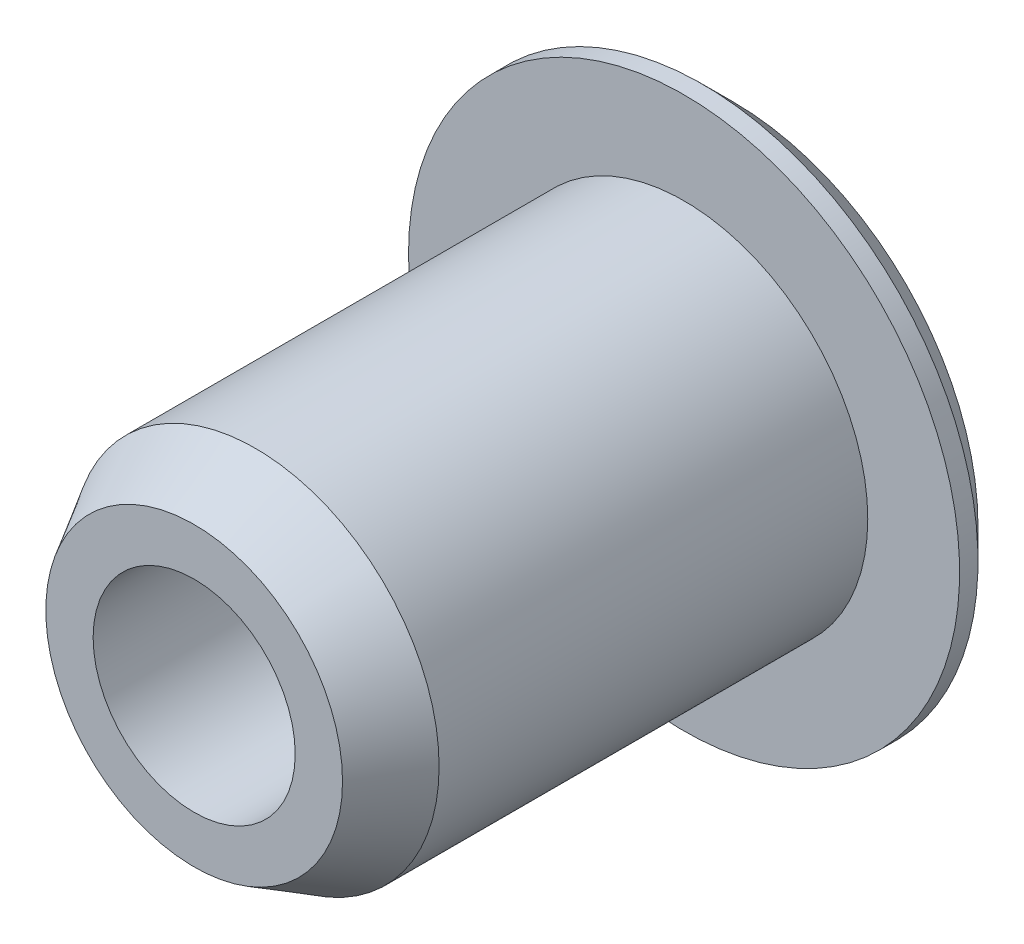
ISO-10303-21;
HEADER;
FILE_DESCRIPTION(('STEP AP214'),'2;1');
FILE_NAME('part.step','',(''),(''),'','','');
FILE_SCHEMA(('AUTOMOTIVE_DESIGN { 1 0 10303 214 1 1 1 1 }'));
ENDSEC;
DATA;
#1=APPLICATION_CONTEXT('core data for automotive mechanical design processes');
#2=APPLICATION_PROTOCOL_DEFINITION('international standard','automotive_design',2000,#1);
#3=PRODUCT_CONTEXT('',#1,'mechanical');
#4=PRODUCT('Part','Part','',(#3));
#5=PRODUCT_RELATED_PRODUCT_CATEGORY('part','',(#4));
#6=PRODUCT_DEFINITION_FORMATION('','',#4);
#7=PRODUCT_DEFINITION_CONTEXT('part definition',#1,'design');
#8=PRODUCT_DEFINITION('design','',#6,#7);
#9=PRODUCT_DEFINITION_SHAPE('','',#8);
#10=(LENGTH_UNIT() NAMED_UNIT(*) SI_UNIT(.MILLI.,.METRE.));
#11=(NAMED_UNIT(*) PLANE_ANGLE_UNIT() SI_UNIT($,.RADIAN.));
#12=(NAMED_UNIT(*) SI_UNIT($,.STERADIAN.) SOLID_ANGLE_UNIT());
#13=UNCERTAINTY_MEASURE_WITH_UNIT(LENGTH_MEASURE(1.E-05),#10,'distance_accuracy_value','');
#14=(GEOMETRIC_REPRESENTATION_CONTEXT(3) GLOBAL_UNCERTAINTY_ASSIGNED_CONTEXT((#13)) GLOBAL_UNIT_ASSIGNED_CONTEXT((#10,
#11,#12)) REPRESENTATION_CONTEXT('',''));
#15=CARTESIAN_POINT('',(0.,0.,0.));
#16=DIRECTION('',(0.,0.,1.));
#17=DIRECTION('',(1.,0.,0.));
#18=AXIS2_PLACEMENT_3D('',#15,#16,#17);
#19=CARTESIAN_POINT('',(0.,0.,8.));
#20=DIRECTION('',(0.,0.,-1.));
#21=DIRECTION('',(-1.,0.,0.));
#22=AXIS2_PLACEMENT_3D('',#19,#20,#21);
#23=CYLINDRICAL_SURFACE('',#22,1.65);
#24=CARTESIAN_POINT('',(0.,0.,8.));
#25=DIRECTION('',(0.,0.,1.));
#26=DIRECTION('',(1.,0.,0.));
#27=AXIS2_PLACEMENT_3D('',#24,#25,#26);
#28=CIRCLE('',#27,1.65);
#29=CARTESIAN_POINT('',(1.65,0.,8.));
#30=VERTEX_POINT('',#29);
#31=EDGE_CURVE('E53',#30,#30,#28,.T.);
#32=ORIENTED_EDGE('',*,*,#31,.T.);
#33=EDGE_LOOP('',(#32));
#34=FACE_BOUND('',#33,.T.);
#35=CARTESIAN_POINT('',(0.,0.,2.2));
#36=DIRECTION('',(0.,0.,-1.));
#37=DIRECTION('',(-1.,0.,0.));
#38=AXIS2_PLACEMENT_3D('',#35,#36,#37);
#39=CIRCLE('',#38,1.65);
#40=CARTESIAN_POINT('',(-1.65,0.,2.2));
#41=VERTEX_POINT('',#40);
#42=EDGE_CURVE('E54',#41,#41,#39,.T.);
#43=ORIENTED_EDGE('',*,*,#42,.T.);
#44=EDGE_LOOP('',(#43));
#45=FACE_BOUND('',#44,.T.);
#46=ADVANCED_FACE('F33',(#34,#45),#23,.F.);
#47=CARTESIAN_POINT('',(0.,0.,8.));
#48=DIRECTION('',(0.,0.,1.));
#49=DIRECTION('',(1.,0.,0.));
#50=AXIS2_PLACEMENT_3D('',#47,#48,#49);
#51=PLANE('',#50);
#52=CARTESIAN_POINT('',(0.,0.,8.));
#53=DIRECTION('',(0.,0.,1.));
#54=DIRECTION('',(1.,0.,0.));
#55=AXIS2_PLACEMENT_3D('',#52,#53,#54);
#56=CIRCLE('',#55,2.42264973081038);
#57=CARTESIAN_POINT('',(2.42264973081038,0.,8.));
#58=VERTEX_POINT('',#57);
#59=EDGE_CURVE('E40',#58,#58,#56,.T.);
#60=ORIENTED_EDGE('',*,*,#59,.T.);
#61=EDGE_LOOP('',(#60));
#62=FACE_BOUND('',#61,.T.);
#63=ORIENTED_EDGE('',*,*,#31,.F.);
#64=EDGE_LOOP('',(#63));
#65=FACE_BOUND('',#64,.T.);
#66=ADVANCED_FACE('F96',(#62,#65),#51,.T.);
#67=CARTESIAN_POINT('',(0.,0.,8.));
#68=DIRECTION('',(0.,0.,-1.));
#69=DIRECTION('',(-1.,0.,0.));
#70=AXIS2_PLACEMENT_3D('',#67,#68,#69);
#71=CYLINDRICAL_SURFACE('',#70,3.);
#72=CARTESIAN_POINT('',(0.,0.,7.));
#73=DIRECTION('',(0.,0.,1.));
#74=DIRECTION('',(1.,0.,0.));
#75=AXIS2_PLACEMENT_3D('',#72,#73,#74);
#76=CIRCLE('',#75,3.);
#77=CARTESIAN_POINT('',(3.,0.,7.));
#78=VERTEX_POINT('',#77);
#79=EDGE_CURVE('E10',#78,#78,#76,.F.);
#80=ORIENTED_EDGE('',*,*,#79,.T.);
#81=EDGE_LOOP('',(#80));
#82=FACE_BOUND('',#81,.T.);
#83=CARTESIAN_POINT('',(0.,0.,0.));
#84=DIRECTION('',(0.,0.,-1.));
#85=DIRECTION('',(-1.,0.,0.));
#86=AXIS2_PLACEMENT_3D('',#83,#84,#85);
#87=CIRCLE('',#86,3.);
#88=CARTESIAN_POINT('',(-3.,0.,0.));
#89=VERTEX_POINT('',#88);
#90=EDGE_CURVE('E61',#89,#89,#87,.T.);
#91=ORIENTED_EDGE('',*,*,#90,.F.);
#92=EDGE_LOOP('',(#91));
#93=FACE_BOUND('',#92,.T.);
#94=ADVANCED_FACE('F92',(#82,#93),#71,.T.);
#95=CARTESIAN_POINT('',(0.,0.,0.));
#96=DIRECTION('',(0.,0.,-1.));
#97=DIRECTION('',(-1.,0.,0.));
#98=AXIS2_PLACEMENT_3D('',#95,#96,#97);
#99=PLANE('',#98);
#100=CARTESIAN_POINT('',(0.,0.,0.));
#101=DIRECTION('',(0.,0.,-1.));
#102=DIRECTION('',(-1.,0.,0.));
#103=AXIS2_PLACEMENT_3D('',#100,#101,#102);
#104=CIRCLE('',#103,4.5);
#105=CARTESIAN_POINT('',(-4.5,0.,0.));
#106=VERTEX_POINT('',#105);
#107=EDGE_CURVE('E57',#106,#106,#104,.T.);
#108=ORIENTED_EDGE('',*,*,#107,.F.);
#109=EDGE_LOOP('',(#108));
#110=FACE_BOUND('',#109,.T.);
#111=ORIENTED_EDGE('',*,*,#90,.T.);
#112=EDGE_LOOP('',(#111));
#113=FACE_BOUND('',#112,.T.);
#114=ADVANCED_FACE('F83',(#110,#113),#99,.F.);
#115=CARTESIAN_POINT('',(0.,0.,-0.8));
#116=DIRECTION('',(0.,0.,-1.));
#117=DIRECTION('',(-1.,0.,0.));
#118=AXIS2_PLACEMENT_3D('',#115,#116,#117);
#119=PLANE('',#118);
#120=CARTESIAN_POINT('',(0.,0.,-0.8));
#121=DIRECTION('',(0.,0.,-1.));
#122=DIRECTION('',(-1.,0.,0.));
#123=AXIS2_PLACEMENT_3D('',#120,#121,#122);
#124=CIRCLE('',#123,4.);
#125=CARTESIAN_POINT('',(-4.,0.,-0.8));
#126=VERTEX_POINT('',#125);
#127=EDGE_CURVE('E48',#126,#126,#124,.T.);
#128=ORIENTED_EDGE('',*,*,#127,.T.);
#129=EDGE_LOOP('',(#128));
#130=FACE_BOUND('',#129,.T.);
#131=CARTESIAN_POINT('',(0.,0.,-0.8));
#132=DIRECTION('',(0.,0.,-1.));
#133=DIRECTION('',(-1.,0.,0.));
#134=AXIS2_PLACEMENT_3D('',#131,#132,#133);
#135=CIRCLE('',#134,2.2);
#136=CARTESIAN_POINT('',(-2.2,0.,-0.8));
#137=VERTEX_POINT('',#136);
#138=EDGE_CURVE('E66',#137,#137,#135,.T.);
#139=ORIENTED_EDGE('',*,*,#138,.F.);
#140=EDGE_LOOP('',(#139));
#141=FACE_BOUND('',#140,.T.);
#142=ADVANCED_FACE('F81',(#130,#141),#119,.T.);
#143=CARTESIAN_POINT('',(0.,0.,-0.8));
#144=DIRECTION('',(0.,0.,1.));
#145=DIRECTION('',(1.,0.,0.));
#146=AXIS2_PLACEMENT_3D('',#143,#144,#145);
#147=CYLINDRICAL_SURFACE('',#146,4.5);
#148=CARTESIAN_POINT('',(0.,0.,-0.299999999999997));
#149=DIRECTION('',(0.,0.,-1.));
#150=DIRECTION('',(-1.,0.,0.));
#151=AXIS2_PLACEMENT_3D('',#148,#149,#150);
#152=CIRCLE('',#151,4.5);
#153=CARTESIAN_POINT('',(-4.5,0.,-0.299999999999997));
#154=VERTEX_POINT('',#153);
#155=EDGE_CURVE('E44',#154,#154,#152,.F.);
#156=ORIENTED_EDGE('',*,*,#155,.T.);
#157=EDGE_LOOP('',(#156));
#158=FACE_BOUND('',#157,.T.);
#159=ORIENTED_EDGE('',*,*,#107,.T.);
#160=EDGE_LOOP('',(#159));
#161=FACE_BOUND('',#160,.T.);
#162=ADVANCED_FACE('F77',(#158,#161),#147,.T.);
#163=CARTESIAN_POINT('',(0.,0.,2.2));
#164=DIRECTION('',(0.,0.,-1.));
#165=DIRECTION('',(-1.,0.,0.));
#166=AXIS2_PLACEMENT_3D('',#163,#164,#165);
#167=CYLINDRICAL_SURFACE('',#166,2.2);
#168=CARTESIAN_POINT('',(0.,0.,2.2));
#169=DIRECTION('',(0.,0.,-1.));
#170=DIRECTION('',(-1.,0.,0.));
#171=AXIS2_PLACEMENT_3D('',#168,#169,#170);
#172=CIRCLE('',#171,2.2);
#173=CARTESIAN_POINT('',(-2.2,0.,2.2));
#174=VERTEX_POINT('',#173);
#175=EDGE_CURVE('E58',#174,#174,#172,.T.);
#176=ORIENTED_EDGE('',*,*,#175,.F.);
#177=EDGE_LOOP('',(#176));
#178=FACE_BOUND('',#177,.T.);
#179=ORIENTED_EDGE('',*,*,#138,.T.);
#180=EDGE_LOOP('',(#179));
#181=FACE_BOUND('',#180,.T.);
#182=ADVANCED_FACE('F74',(#178,#181),#167,.F.);
#183=CARTESIAN_POINT('',(0.,0.,2.2));
#184=DIRECTION('',(0.,0.,-1.));
#185=DIRECTION('',(-1.,0.,0.));
#186=AXIS2_PLACEMENT_3D('',#183,#184,#185);
#187=PLANE('',#186);
#188=ORIENTED_EDGE('',*,*,#42,.F.);
#189=EDGE_LOOP('',(#188));
#190=FACE_BOUND('',#189,.T.);
#191=ORIENTED_EDGE('',*,*,#175,.T.);
#192=EDGE_LOOP('',(#191));
#193=FACE_BOUND('',#192,.T.);
#194=ADVANCED_FACE('F72',(#190,#193),#187,.T.);
#195=CARTESIAN_POINT('',(0.,0.,-0.8));
#196=DIRECTION('',(0.,0.,1.));
#197=DIRECTION('',(1.,0.,0.));
#198=AXIS2_PLACEMENT_3D('',#195,#196,#197);
#199=CONICAL_SURFACE('',#198,4.,0.785398163397445);
#200=ORIENTED_EDGE('',*,*,#155,.F.);
#201=EDGE_LOOP('',(#200));
#202=FACE_BOUND('',#201,.T.);
#203=ORIENTED_EDGE('',*,*,#127,.F.);
#204=EDGE_LOOP('',(#203));
#205=FACE_BOUND('',#204,.T.);
#206=ADVANCED_FACE('F106',(#202,#205),#199,.T.);
#207=CARTESIAN_POINT('',(0.,0.,8.));
#208=DIRECTION('',(0.,0.,-1.));
#209=DIRECTION('',(-1.,0.,0.));
#210=AXIS2_PLACEMENT_3D('',#207,#208,#209);
#211=CONICAL_SURFACE('',#210,2.42264973081038,0.523598775598297);
#212=ORIENTED_EDGE('',*,*,#79,.F.);
#213=EDGE_LOOP('',(#212));
#214=FACE_BOUND('',#213,.T.);
#215=ORIENTED_EDGE('',*,*,#59,.F.);
#216=EDGE_LOOP('',(#215));
#217=FACE_BOUND('',#216,.T.);
#218=ADVANCED_FACE('F35',(#214,#217),#211,.T.);
#219=CLOSED_SHELL('',(#46,#66,#94,#114,#142,#162,#182,#194,#206,#218));
#220=MANIFOLD_SOLID_BREP('B2',#219);
#221=ADVANCED_BREP_SHAPE_REPRESENTATION('',(#18,#220),#14);
#222=SHAPE_DEFINITION_REPRESENTATION(#9,#221);
ENDSEC;
END-ISO-10303-21;
